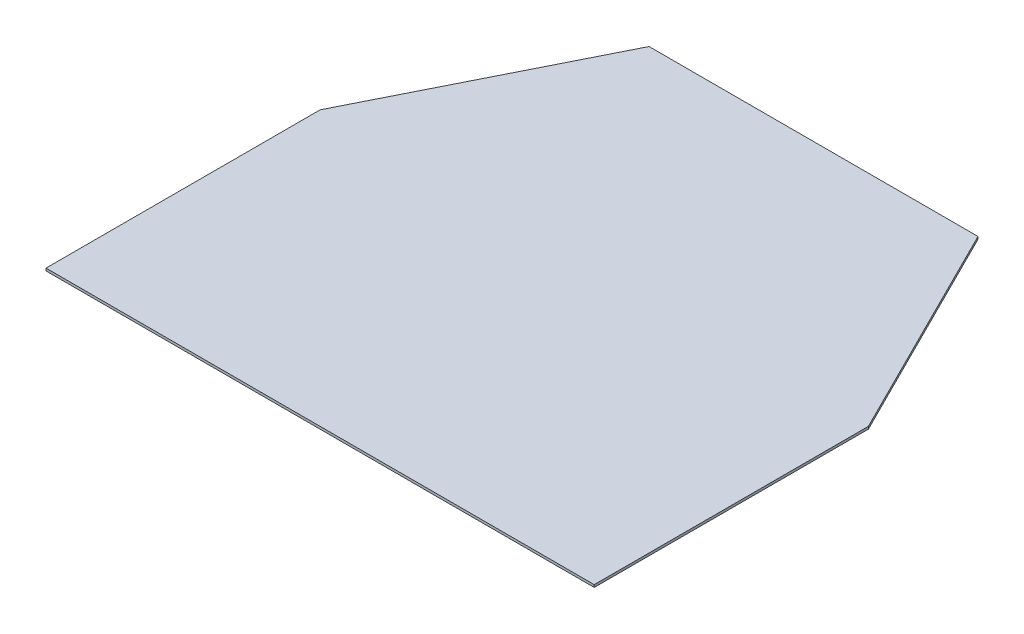
ISO-10303-21;
HEADER;
FILE_DESCRIPTION(('STEP AP214'),'2;1');
FILE_NAME('part.step','',(''),(''),'','','');
FILE_SCHEMA(('AUTOMOTIVE_DESIGN { 1 0 10303 214 1 1 1 1 }'));
ENDSEC;
DATA;
#1=APPLICATION_CONTEXT('core data for automotive mechanical design processes');
#2=APPLICATION_PROTOCOL_DEFINITION('international standard','automotive_design',2000,#1);
#3=PRODUCT_CONTEXT('',#1,'mechanical');
#4=PRODUCT('Part','Part','',(#3));
#5=PRODUCT_RELATED_PRODUCT_CATEGORY('part','',(#4));
#6=PRODUCT_DEFINITION_FORMATION('','',#4);
#7=PRODUCT_DEFINITION_CONTEXT('part definition',#1,'design');
#8=PRODUCT_DEFINITION('design','',#6,#7);
#9=PRODUCT_DEFINITION_SHAPE('','',#8);
#10=(LENGTH_UNIT() NAMED_UNIT(*) SI_UNIT(.MILLI.,.METRE.));
#11=(NAMED_UNIT(*) PLANE_ANGLE_UNIT() SI_UNIT($,.RADIAN.));
#12=(NAMED_UNIT(*) SI_UNIT($,.STERADIAN.) SOLID_ANGLE_UNIT());
#13=UNCERTAINTY_MEASURE_WITH_UNIT(LENGTH_MEASURE(1.E-05),#10,'distance_accuracy_value','');
#14=(GEOMETRIC_REPRESENTATION_CONTEXT(3) GLOBAL_UNCERTAINTY_ASSIGNED_CONTEXT((#13)) GLOBAL_UNIT_ASSIGNED_CONTEXT((#10,
#11,#12)) REPRESENTATION_CONTEXT('',''));
#15=CARTESIAN_POINT('',(0.,0.,0.));
#16=DIRECTION('',(0.,0.,1.));
#17=DIRECTION('',(1.,0.,0.));
#18=AXIS2_PLACEMENT_3D('',#15,#16,#17);
#19=CARTESIAN_POINT('',(254.,2.286,228.6));
#20=DIRECTION('',(-1.,0.,0.));
#21=DIRECTION('',(0.,0.,1.));
#22=AXIS2_PLACEMENT_3D('',#19,#20,#21);
#23=PLANE('',#22);
#24=DIRECTION('',(0.,0.,-1.));
#25=VECTOR('',#24,1.);
#26=CARTESIAN_POINT('',(254.,0.,228.6));
#27=LINE('',#26,#25);
#28=CARTESIAN_POINT('',(254.,0.,228.6));
#29=VERTEX_POINT('',#28);
#30=CARTESIAN_POINT('',(254.,0.,-25.3999999999987));
#31=VERTEX_POINT('',#30);
#32=EDGE_CURVE('E114',#29,#31,#27,.T.);
#33=ORIENTED_EDGE('',*,*,#32,.T.);
#34=DIRECTION('',(0.,1.,0.));
#35=VECTOR('',#34,1.);
#36=CARTESIAN_POINT('',(254.,2.286,-25.3999999999987));
#37=LINE('',#36,#35);
#38=CARTESIAN_POINT('',(254.,2.286,-25.3999999999987));
#39=VERTEX_POINT('',#38);
#40=EDGE_CURVE('E127',#31,#39,#37,.T.);
#41=ORIENTED_EDGE('',*,*,#40,.T.);
#42=DIRECTION('',(0.,0.,-1.));
#43=VECTOR('',#42,1.);
#44=CARTESIAN_POINT('',(254.,2.286,228.6));
#45=LINE('',#44,#43);
#46=CARTESIAN_POINT('',(254.,2.286,228.6));
#47=VERTEX_POINT('',#46);
#48=EDGE_CURVE('E121',#47,#39,#45,.T.);
#49=ORIENTED_EDGE('',*,*,#48,.F.);
#50=DIRECTION('',(0.,-1.,0.));
#51=VECTOR('',#50,1.);
#52=CARTESIAN_POINT('',(254.,2.286,228.6));
#53=LINE('',#52,#51);
#54=EDGE_CURVE('E105',#47,#29,#53,.T.);
#55=ORIENTED_EDGE('',*,*,#54,.T.);
#56=EDGE_LOOP('',(#33,#41,#49,#55));
#57=FACE_BOUND('',#56,.T.);
#58=ADVANCED_FACE('F33',(#57),#23,.F.);
#59=CARTESIAN_POINT('',(-254.,2.286,-228.6));
#60=DIRECTION('',(0.,0.,1.));
#61=DIRECTION('',(1.,0.,0.));
#62=AXIS2_PLACEMENT_3D('',#59,#60,#61);
#63=PLANE('',#62);
#64=DIRECTION('',(-1.,0.,0.));
#65=VECTOR('',#64,1.);
#66=CARTESIAN_POINT('',(-254.,0.,-228.6));
#67=LINE('',#66,#65);
#68=CARTESIAN_POINT('',(152.4,0.,-228.6));
#69=VERTEX_POINT('',#68);
#70=CARTESIAN_POINT('',(-152.4,0.,-228.6));
#71=VERTEX_POINT('',#70);
#72=EDGE_CURVE('E117',#69,#71,#67,.T.);
#73=ORIENTED_EDGE('',*,*,#72,.T.);
#74=DIRECTION('',(0.,1.,0.));
#75=VECTOR('',#74,1.);
#76=CARTESIAN_POINT('',(-152.4,2.286,-228.6));
#77=LINE('',#76,#75);
#78=CARTESIAN_POINT('',(-152.4,2.286,-228.6));
#79=VERTEX_POINT('',#78);
#80=EDGE_CURVE('E41',#71,#79,#77,.T.);
#81=ORIENTED_EDGE('',*,*,#80,.T.);
#82=DIRECTION('',(-1.,0.,0.));
#83=VECTOR('',#82,1.);
#84=CARTESIAN_POINT('',(-254.,2.286,-228.6));
#85=LINE('',#84,#83);
#86=CARTESIAN_POINT('',(152.4,2.286,-228.6));
#87=VERTEX_POINT('',#86);
#88=EDGE_CURVE('E96',#87,#79,#85,.T.);
#89=ORIENTED_EDGE('',*,*,#88,.F.);
#90=DIRECTION('',(0.,-1.,0.));
#91=VECTOR('',#90,1.);
#92=CARTESIAN_POINT('',(152.4,2.286,-228.6));
#93=LINE('',#92,#91);
#94=EDGE_CURVE('E104',#87,#69,#93,.T.);
#95=ORIENTED_EDGE('',*,*,#94,.T.);
#96=EDGE_LOOP('',(#73,#81,#89,#95));
#97=FACE_BOUND('',#96,.T.);
#98=ADVANCED_FACE('F148',(#97),#63,.F.);
#99=CARTESIAN_POINT('',(-254.,2.286,228.6));
#100=DIRECTION('',(1.,0.,0.));
#101=DIRECTION('',(0.,0.,-1.));
#102=AXIS2_PLACEMENT_3D('',#99,#100,#101);
#103=PLANE('',#102);
#104=DIRECTION('',(0.,0.,1.));
#105=VECTOR('',#104,1.);
#106=CARTESIAN_POINT('',(-254.,2.286,228.6));
#107=LINE('',#106,#105);
#108=CARTESIAN_POINT('',(-254.,2.286,-25.3999999999985));
#109=VERTEX_POINT('',#108);
#110=CARTESIAN_POINT('',(-254.,2.286,228.6));
#111=VERTEX_POINT('',#110);
#112=EDGE_CURVE('E85',#109,#111,#107,.T.);
#113=ORIENTED_EDGE('',*,*,#112,.F.);
#114=DIRECTION('',(0.,-1.,0.));
#115=VECTOR('',#114,1.);
#116=CARTESIAN_POINT('',(-254.,2.286,-25.3999999999985));
#117=LINE('',#116,#115);
#118=CARTESIAN_POINT('',(-254.,0.,-25.3999999999985));
#119=VERTEX_POINT('',#118);
#120=EDGE_CURVE('E131',#109,#119,#117,.T.);
#121=ORIENTED_EDGE('',*,*,#120,.T.);
#122=DIRECTION('',(0.,0.,1.));
#123=VECTOR('',#122,1.);
#124=CARTESIAN_POINT('',(-254.,0.,228.6));
#125=LINE('',#124,#123);
#126=CARTESIAN_POINT('',(-254.,0.,228.6));
#127=VERTEX_POINT('',#126);
#128=EDGE_CURVE('E101',#119,#127,#125,.T.);
#129=ORIENTED_EDGE('',*,*,#128,.T.);
#130=DIRECTION('',(0.,-1.,0.));
#131=VECTOR('',#130,1.);
#132=CARTESIAN_POINT('',(-254.,2.286,228.6));
#133=LINE('',#132,#131);
#134=EDGE_CURVE('E99',#111,#127,#133,.T.);
#135=ORIENTED_EDGE('',*,*,#134,.F.);
#136=EDGE_LOOP('',(#113,#121,#129,#135));
#137=FACE_BOUND('',#136,.T.);
#138=ADVANCED_FACE('F100',(#137),#103,.F.);
#139=CARTESIAN_POINT('',(-254.,2.286,228.6));
#140=DIRECTION('',(0.,0.,-1.));
#141=DIRECTION('',(-1.,0.,0.));
#142=AXIS2_PLACEMENT_3D('',#139,#140,#141);
#143=PLANE('',#142);
#144=DIRECTION('',(1.,0.,0.));
#145=VECTOR('',#144,1.);
#146=CARTESIAN_POINT('',(-254.,0.,228.6));
#147=LINE('',#146,#145);
#148=EDGE_CURVE('E120',#127,#29,#147,.T.);
#149=ORIENTED_EDGE('',*,*,#148,.T.);
#150=ORIENTED_EDGE('',*,*,#54,.F.);
#151=DIRECTION('',(1.,0.,0.));
#152=VECTOR('',#151,1.);
#153=CARTESIAN_POINT('',(-254.,2.286,228.6));
#154=LINE('',#153,#152);
#155=EDGE_CURVE('E90',#111,#47,#154,.T.);
#156=ORIENTED_EDGE('',*,*,#155,.F.);
#157=ORIENTED_EDGE('',*,*,#134,.T.);
#158=EDGE_LOOP('',(#149,#150,#156,#157));
#159=FACE_BOUND('',#158,.T.);
#160=ADVANCED_FACE('F107',(#159),#143,.F.);
#161=CARTESIAN_POINT('',(0.,2.286,0.));
#162=DIRECTION('',(0.,-1.,0.));
#163=DIRECTION('',(0.,0.,-1.));
#164=AXIS2_PLACEMENT_3D('',#161,#162,#163);
#165=PLANE('',#164);
#166=ORIENTED_EDGE('',*,*,#88,.T.);
#167=DIRECTION('',(0.447213595499956,0.,-0.894427190999917));
#168=VECTOR('',#167,1.);
#169=CARTESIAN_POINT('',(-254.,2.286,-25.3999999999985));
#170=LINE('',#169,#168);
#171=EDGE_CURVE('E11',#79,#109,#170,.F.);
#172=ORIENTED_EDGE('',*,*,#171,.T.);
#173=ORIENTED_EDGE('',*,*,#112,.T.);
#174=ORIENTED_EDGE('',*,*,#155,.T.);
#175=ORIENTED_EDGE('',*,*,#48,.T.);
#176=DIRECTION('',(0.447213595499956,0.,0.894427190999917));
#177=VECTOR('',#176,1.);
#178=CARTESIAN_POINT('',(152.4,2.286,-228.6));
#179=LINE('',#178,#177);
#180=EDGE_CURVE('E129',#39,#87,#179,.F.);
#181=ORIENTED_EDGE('',*,*,#180,.T.);
#182=EDGE_LOOP('',(#166,#172,#173,#174,#175,#181));
#183=FACE_BOUND('',#182,.T.);
#184=ADVANCED_FACE('F87',(#183),#165,.F.);
#185=CARTESIAN_POINT('',(0.,0.,0.));
#186=DIRECTION('',(0.,-1.,0.));
#187=DIRECTION('',(0.,0.,-1.));
#188=AXIS2_PLACEMENT_3D('',#185,#186,#187);
#189=PLANE('',#188);
#190=ORIENTED_EDGE('',*,*,#128,.F.);
#191=DIRECTION('',(-0.447213595499956,0.,0.894427190999917));
#192=VECTOR('',#191,1.);
#193=CARTESIAN_POINT('',(-213.36,0.,-106.679999999999));
#194=LINE('',#193,#192);
#195=EDGE_CURVE('E55',#119,#71,#194,.F.);
#196=ORIENTED_EDGE('',*,*,#195,.T.);
#197=ORIENTED_EDGE('',*,*,#72,.F.);
#198=DIRECTION('',(-0.447213595499956,0.,-0.894427190999917));
#199=VECTOR('',#198,1.);
#200=CARTESIAN_POINT('',(213.36,0.,-106.679999999999));
#201=LINE('',#200,#199);
#202=EDGE_CURVE('E125',#69,#31,#201,.F.);
#203=ORIENTED_EDGE('',*,*,#202,.T.);
#204=ORIENTED_EDGE('',*,*,#32,.F.);
#205=ORIENTED_EDGE('',*,*,#148,.F.);
#206=EDGE_LOOP('',(#190,#196,#197,#203,#204,#205));
#207=FACE_BOUND('',#206,.T.);
#208=ADVANCED_FACE('F134',(#207),#189,.T.);
#209=CARTESIAN_POINT('',(152.4,2.286,-228.6));
#210=DIRECTION('',(-0.894427190999917,0.,0.447213595499956));
#211=DIRECTION('',(0.,-1.,0.));
#212=AXIS2_PLACEMENT_3D('',#209,#210,#211);
#213=PLANE('',#212);
#214=ORIENTED_EDGE('',*,*,#180,.F.);
#215=ORIENTED_EDGE('',*,*,#40,.F.);
#216=ORIENTED_EDGE('',*,*,#202,.F.);
#217=ORIENTED_EDGE('',*,*,#94,.F.);
#218=EDGE_LOOP('',(#214,#215,#216,#217));
#219=FACE_BOUND('',#218,.T.);
#220=ADVANCED_FACE('F142',(#219),#213,.F.);
#221=CARTESIAN_POINT('',(-254.,2.286,-25.3999999999985));
#222=DIRECTION('',(0.894427190999917,0.,0.447213595499956));
#223=DIRECTION('',(0.,-1.,0.));
#224=AXIS2_PLACEMENT_3D('',#221,#222,#223);
#225=PLANE('',#224);
#226=ORIENTED_EDGE('',*,*,#171,.F.);
#227=ORIENTED_EDGE('',*,*,#80,.F.);
#228=ORIENTED_EDGE('',*,*,#195,.F.);
#229=ORIENTED_EDGE('',*,*,#120,.F.);
#230=EDGE_LOOP('',(#226,#227,#228,#229));
#231=FACE_BOUND('',#230,.T.);
#232=ADVANCED_FACE('F35',(#231),#225,.F.);
#233=CLOSED_SHELL('',(#58,#98,#138,#160,#184,#208,#220,#232));
#234=MANIFOLD_SOLID_BREP('B2',#233);
#235=ADVANCED_BREP_SHAPE_REPRESENTATION('',(#18,#234),#14);
#236=SHAPE_DEFINITION_REPRESENTATION(#9,#235);
ENDSEC;
END-ISO-10303-21;
